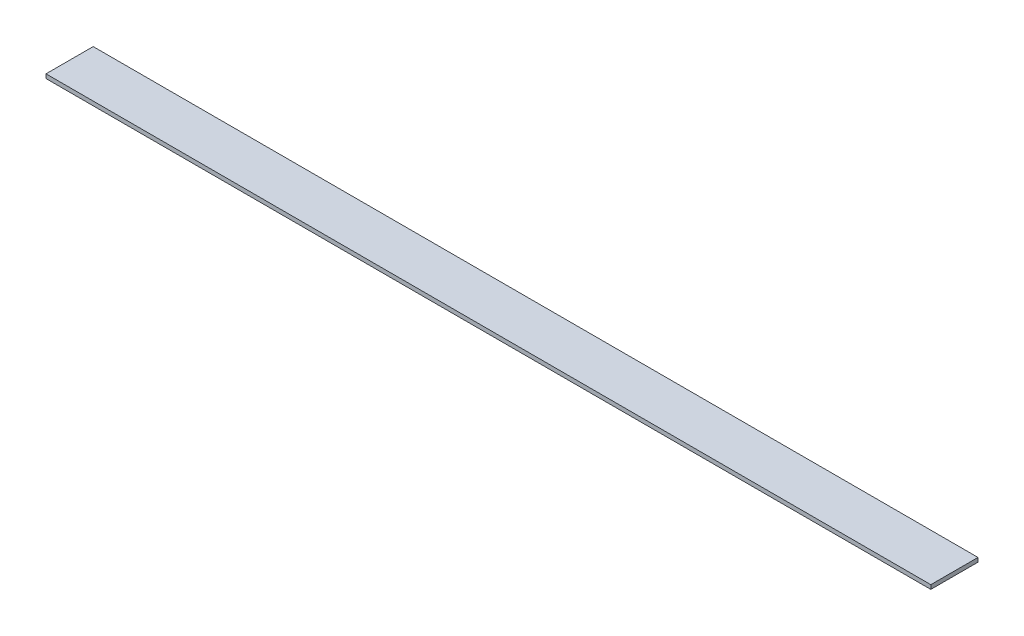
ISO-10303-21;
HEADER;
FILE_DESCRIPTION(('STEP AP214'),'2;1');
FILE_NAME('part.step','',(''),(''),'','','');
FILE_SCHEMA(('AUTOMOTIVE_DESIGN { 1 0 10303 214 1 1 1 1 }'));
ENDSEC;
DATA;
#1=APPLICATION_CONTEXT('core data for automotive mechanical design processes');
#2=APPLICATION_PROTOCOL_DEFINITION('international standard','automotive_design',2000,#1);
#3=PRODUCT_CONTEXT('',#1,'mechanical');
#4=PRODUCT('Part','Part','',(#3));
#5=PRODUCT_RELATED_PRODUCT_CATEGORY('part','',(#4));
#6=PRODUCT_DEFINITION_FORMATION('','',#4);
#7=PRODUCT_DEFINITION_CONTEXT('part definition',#1,'design');
#8=PRODUCT_DEFINITION('design','',#6,#7);
#9=PRODUCT_DEFINITION_SHAPE('','',#8);
#10=(LENGTH_UNIT() NAMED_UNIT(*) SI_UNIT(.MILLI.,.METRE.));
#11=(NAMED_UNIT(*) PLANE_ANGLE_UNIT() SI_UNIT($,.RADIAN.));
#12=(NAMED_UNIT(*) SI_UNIT($,.STERADIAN.) SOLID_ANGLE_UNIT());
#13=UNCERTAINTY_MEASURE_WITH_UNIT(LENGTH_MEASURE(1.E-05),#10,'distance_accuracy_value','');
#14=(GEOMETRIC_REPRESENTATION_CONTEXT(3) GLOBAL_UNCERTAINTY_ASSIGNED_CONTEXT((#13)) GLOBAL_UNIT_ASSIGNED_CONTEXT((#10,
#11,#12)) REPRESENTATION_CONTEXT('',''));
#15=CARTESIAN_POINT('',(0.,0.,0.));
#16=DIRECTION('',(0.,0.,1.));
#17=DIRECTION('',(1.,0.,0.));
#18=AXIS2_PLACEMENT_3D('',#15,#16,#17);
#19=CARTESIAN_POINT('',(-750.,7.,-40.));
#20=DIRECTION('',(1.,0.,0.));
#21=DIRECTION('',(0.,0.,-1.));
#22=AXIS2_PLACEMENT_3D('',#19,#20,#21);
#23=PLANE('',#22);
#24=DIRECTION('',(0.,0.,1.));
#25=VECTOR('',#24,1.);
#26=CARTESIAN_POINT('',(-750.,0.,-40.));
#27=LINE('',#26,#25);
#28=CARTESIAN_POINT('',(-750.,0.,-40.));
#29=VERTEX_POINT('',#28);
#30=CARTESIAN_POINT('',(-750.,0.,40.));
#31=VERTEX_POINT('',#30);
#32=EDGE_CURVE('E116',#29,#31,#27,.T.);
#33=ORIENTED_EDGE('',*,*,#32,.T.);
#34=DIRECTION('',(0.,-1.,0.));
#35=VECTOR('',#34,1.);
#36=CARTESIAN_POINT('',(-750.,7.,40.));
#37=LINE('',#36,#35);
#38=CARTESIAN_POINT('',(-750.,7.,40.));
#39=VERTEX_POINT('',#38);
#40=EDGE_CURVE('E11',#39,#31,#37,.T.);
#41=ORIENTED_EDGE('',*,*,#40,.F.);
#42=DIRECTION('',(0.,0.,1.));
#43=VECTOR('',#42,1.);
#44=CARTESIAN_POINT('',(-750.,7.,-40.));
#45=LINE('',#44,#43);
#46=CARTESIAN_POINT('',(-750.,7.,-40.));
#47=VERTEX_POINT('',#46);
#48=EDGE_CURVE('E99',#47,#39,#45,.T.);
#49=ORIENTED_EDGE('',*,*,#48,.F.);
#50=DIRECTION('',(0.,-1.,0.));
#51=VECTOR('',#50,1.);
#52=CARTESIAN_POINT('',(-750.,7.,-40.));
#53=LINE('',#52,#51);
#54=EDGE_CURVE('E112',#47,#29,#53,.T.);
#55=ORIENTED_EDGE('',*,*,#54,.T.);
#56=EDGE_LOOP('',(#33,#41,#49,#55));
#57=FACE_BOUND('',#56,.T.);
#58=ADVANCED_FACE('F39',(#57),#23,.F.);
#59=CARTESIAN_POINT('',(-750.,7.,40.));
#60=DIRECTION('',(0.,0.,-1.));
#61=DIRECTION('',(-1.,0.,0.));
#62=AXIS2_PLACEMENT_3D('',#59,#60,#61);
#63=PLANE('',#62);
#64=DIRECTION('',(1.,0.,0.));
#65=VECTOR('',#64,1.);
#66=CARTESIAN_POINT('',(-750.,0.,40.));
#67=LINE('',#66,#65);
#68=CARTESIAN_POINT('',(750.,0.,39.9999999999998));
#69=VERTEX_POINT('',#68);
#70=EDGE_CURVE('E104',#31,#69,#67,.T.);
#71=ORIENTED_EDGE('',*,*,#70,.T.);
#72=DIRECTION('',(0.,-1.,0.));
#73=VECTOR('',#72,1.);
#74=CARTESIAN_POINT('',(750.,7.,39.9999999999998));
#75=LINE('',#74,#73);
#76=CARTESIAN_POINT('',(750.,7.,39.9999999999998));
#77=VERTEX_POINT('',#76);
#78=EDGE_CURVE('E48',#77,#69,#75,.T.);
#79=ORIENTED_EDGE('',*,*,#78,.F.);
#80=DIRECTION('',(1.,0.,0.));
#81=VECTOR('',#80,1.);
#82=CARTESIAN_POINT('',(-750.,7.,40.));
#83=LINE('',#82,#81);
#84=EDGE_CURVE('E94',#39,#77,#83,.T.);
#85=ORIENTED_EDGE('',*,*,#84,.F.);
#86=ORIENTED_EDGE('',*,*,#40,.T.);
#87=EDGE_LOOP('',(#71,#79,#85,#86));
#88=FACE_BOUND('',#87,.T.);
#89=ADVANCED_FACE('F103',(#88),#63,.F.);
#90=CARTESIAN_POINT('',(750.,7.,-40.0000000000002));
#91=DIRECTION('',(-1.,0.,0.));
#92=DIRECTION('',(0.,0.,1.));
#93=AXIS2_PLACEMENT_3D('',#90,#91,#92);
#94=PLANE('',#93);
#95=DIRECTION('',(0.,0.,-1.));
#96=VECTOR('',#95,1.);
#97=CARTESIAN_POINT('',(750.,0.,-40.0000000000002));
#98=LINE('',#97,#96);
#99=CARTESIAN_POINT('',(750.,0.,-40.0000000000002));
#100=VERTEX_POINT('',#99);
#101=EDGE_CURVE('E80',#69,#100,#98,.T.);
#102=ORIENTED_EDGE('',*,*,#101,.T.);
#103=DIRECTION('',(0.,-1.,0.));
#104=VECTOR('',#103,1.);
#105=CARTESIAN_POINT('',(750.,7.,-40.0000000000002));
#106=LINE('',#105,#104);
#107=CARTESIAN_POINT('',(750.,7.,-40.0000000000002));
#108=VERTEX_POINT('',#107);
#109=EDGE_CURVE('E106',#108,#100,#106,.T.);
#110=ORIENTED_EDGE('',*,*,#109,.F.);
#111=DIRECTION('',(0.,0.,-1.));
#112=VECTOR('',#111,1.);
#113=CARTESIAN_POINT('',(750.,7.,-40.0000000000002));
#114=LINE('',#113,#112);
#115=EDGE_CURVE('E97',#77,#108,#114,.T.);
#116=ORIENTED_EDGE('',*,*,#115,.F.);
#117=ORIENTED_EDGE('',*,*,#78,.T.);
#118=EDGE_LOOP('',(#102,#110,#116,#117));
#119=FACE_BOUND('',#118,.T.);
#120=ADVANCED_FACE('F107',(#119),#94,.F.);
#121=CARTESIAN_POINT('',(-750.,7.,-40.));
#122=DIRECTION('',(0.,0.,1.));
#123=DIRECTION('',(1.,0.,0.));
#124=AXIS2_PLACEMENT_3D('',#121,#122,#123);
#125=PLANE('',#124);
#126=DIRECTION('',(-1.,0.,0.));
#127=VECTOR('',#126,1.);
#128=CARTESIAN_POINT('',(-750.,0.,-40.));
#129=LINE('',#128,#127);
#130=EDGE_CURVE('E86',#100,#29,#129,.T.);
#131=ORIENTED_EDGE('',*,*,#130,.T.);
#132=ORIENTED_EDGE('',*,*,#54,.F.);
#133=DIRECTION('',(-1.,0.,0.));
#134=VECTOR('',#133,1.);
#135=CARTESIAN_POINT('',(-750.,7.,-40.));
#136=LINE('',#135,#134);
#137=EDGE_CURVE('E59',#108,#47,#136,.T.);
#138=ORIENTED_EDGE('',*,*,#137,.F.);
#139=ORIENTED_EDGE('',*,*,#109,.T.);
#140=EDGE_LOOP('',(#131,#132,#138,#139));
#141=FACE_BOUND('',#140,.T.);
#142=ADVANCED_FACE('F128',(#141),#125,.F.);
#143=CARTESIAN_POINT('',(0.,7.,0.));
#144=DIRECTION('',(0.,1.,0.));
#145=DIRECTION('',(0.,0.,1.));
#146=AXIS2_PLACEMENT_3D('',#143,#144,#145);
#147=PLANE('',#146);
#148=ORIENTED_EDGE('',*,*,#48,.T.);
#149=ORIENTED_EDGE('',*,*,#84,.T.);
#150=ORIENTED_EDGE('',*,*,#115,.T.);
#151=ORIENTED_EDGE('',*,*,#137,.T.);
#152=EDGE_LOOP('',(#148,#149,#150,#151));
#153=FACE_BOUND('',#152,.T.);
#154=ADVANCED_FACE('F95',(#153),#147,.T.);
#155=CARTESIAN_POINT('',(0.,0.,0.));
#156=DIRECTION('',(0.,1.,0.));
#157=DIRECTION('',(0.,0.,1.));
#158=AXIS2_PLACEMENT_3D('',#155,#156,#157);
#159=PLANE('',#158);
#160=ORIENTED_EDGE('',*,*,#32,.F.);
#161=ORIENTED_EDGE('',*,*,#130,.F.);
#162=ORIENTED_EDGE('',*,*,#101,.F.);
#163=ORIENTED_EDGE('',*,*,#70,.F.);
#164=EDGE_LOOP('',(#160,#161,#162,#163));
#165=FACE_BOUND('',#164,.T.);
#166=ADVANCED_FACE('F131',(#165),#159,.F.);
#167=CLOSED_SHELL('',(#58,#89,#120,#142,#154,#166));
#168=MANIFOLD_SOLID_BREP('B2',#167);
#169=ADVANCED_BREP_SHAPE_REPRESENTATION('',(#18,#168),#14);
#170=SHAPE_DEFINITION_REPRESENTATION(#9,#169);
ENDSEC;
END-ISO-10303-21;
